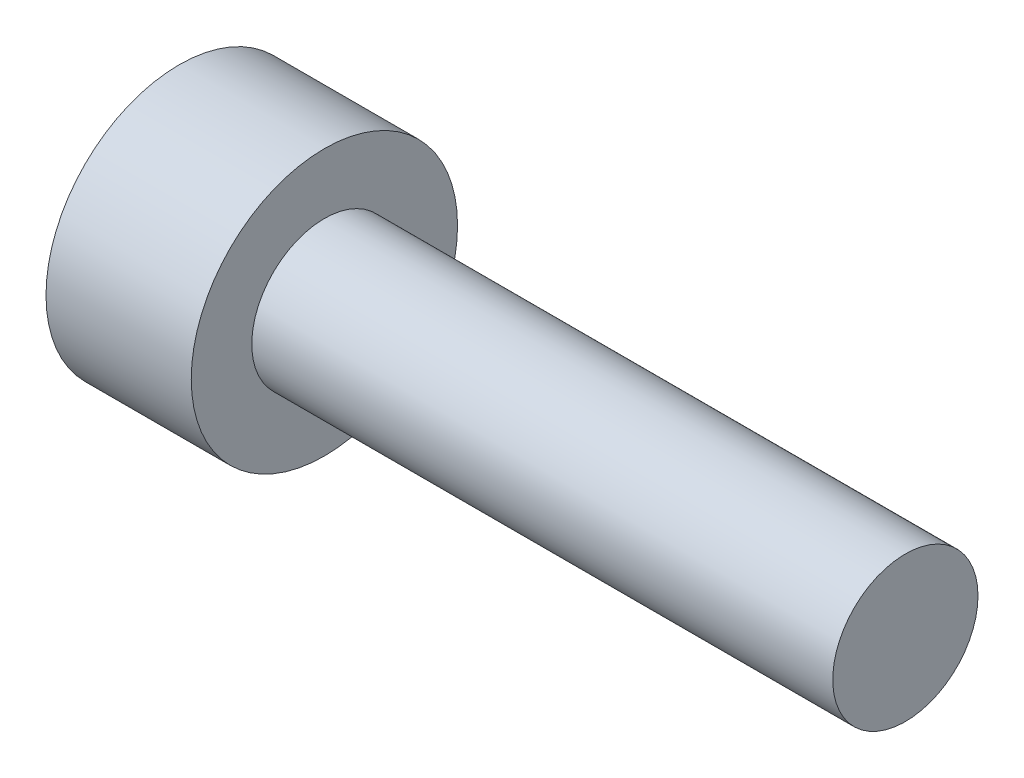
ISO-10303-21;
HEADER;
FILE_DESCRIPTION(('STEP AP214'),'2;1');
FILE_NAME('part.step','',(''),(''),'','','');
FILE_SCHEMA(('AUTOMOTIVE_DESIGN { 1 0 10303 214 1 1 1 1 }'));
ENDSEC;
DATA;
#1=APPLICATION_CONTEXT('core data for automotive mechanical design processes');
#2=APPLICATION_PROTOCOL_DEFINITION('international standard','automotive_design',2000,#1);
#3=PRODUCT_CONTEXT('',#1,'mechanical');
#4=PRODUCT('Part','Part','',(#3));
#5=PRODUCT_RELATED_PRODUCT_CATEGORY('part','',(#4));
#6=PRODUCT_DEFINITION_FORMATION('','',#4);
#7=PRODUCT_DEFINITION_CONTEXT('part definition',#1,'design');
#8=PRODUCT_DEFINITION('design','',#6,#7);
#9=PRODUCT_DEFINITION_SHAPE('','',#8);
#10=(LENGTH_UNIT() NAMED_UNIT(*) SI_UNIT(.MILLI.,.METRE.));
#11=(NAMED_UNIT(*) PLANE_ANGLE_UNIT() SI_UNIT($,.RADIAN.));
#12=(NAMED_UNIT(*) SI_UNIT($,.STERADIAN.) SOLID_ANGLE_UNIT());
#13=UNCERTAINTY_MEASURE_WITH_UNIT(LENGTH_MEASURE(1.E-05),#10,'distance_accuracy_value','');
#14=(GEOMETRIC_REPRESENTATION_CONTEXT(3) GLOBAL_UNCERTAINTY_ASSIGNED_CONTEXT((#13)) GLOBAL_UNIT_ASSIGNED_CONTEXT((#10,
#11,#12)) REPRESENTATION_CONTEXT('',''));
#15=CARTESIAN_POINT('',(0.,0.,0.));
#16=DIRECTION('',(0.,0.,1.));
#17=DIRECTION('',(1.,0.,0.));
#18=AXIS2_PLACEMENT_3D('',#15,#16,#17);
#19=CARTESIAN_POINT('',(25.,-38.,-11.5));
#20=DIRECTION('',(-1.,0.,0.));
#21=DIRECTION('',(0.,0.,1.));
#22=AXIS2_PLACEMENT_3D('',#19,#20,#21);
#23=CYLINDRICAL_SURFACE('',#22,1.5);
#24=CARTESIAN_POINT('',(25.,-38.,-11.5));
#25=DIRECTION('',(1.,0.,0.));
#26=DIRECTION('',(0.,0.,-1.));
#27=AXIS2_PLACEMENT_3D('',#24,#25,#26);
#28=CIRCLE('',#27,1.5);
#29=CARTESIAN_POINT('',(25.,-38.,-13.));
#30=VERTEX_POINT('',#29);
#31=EDGE_CURVE('E10',#30,#30,#28,.T.);
#32=ORIENTED_EDGE('',*,*,#31,.F.);
#33=EDGE_LOOP('',(#32));
#34=FACE_BOUND('',#33,.T.);
#35=CARTESIAN_POINT('',(13.,-38.,-11.5));
#36=DIRECTION('',(1.,0.,0.));
#37=DIRECTION('',(0.,0.,-1.));
#38=AXIS2_PLACEMENT_3D('',#35,#36,#37);
#39=CIRCLE('',#38,1.5);
#40=CARTESIAN_POINT('',(13.,-38.,-13.));
#41=VERTEX_POINT('',#40);
#42=EDGE_CURVE('E45',#41,#41,#39,.T.);
#43=ORIENTED_EDGE('',*,*,#42,.T.);
#44=EDGE_LOOP('',(#43));
#45=FACE_BOUND('',#44,.T.);
#46=ADVANCED_FACE('F39',(#34,#45),#23,.T.);
#47=CARTESIAN_POINT('',(25.,-38.,-11.5));
#48=DIRECTION('',(1.,0.,0.));
#49=DIRECTION('',(0.,0.,-1.));
#50=AXIS2_PLACEMENT_3D('',#47,#48,#49);
#51=PLANE('',#50);
#52=ORIENTED_EDGE('',*,*,#31,.T.);
#53=EDGE_LOOP('',(#52));
#54=FACE_BOUND('',#53,.T.);
#55=ADVANCED_FACE('F62',(#54),#51,.T.);
#56=CARTESIAN_POINT('',(13.,-38.,-11.5));
#57=DIRECTION('',(-1.,0.,0.));
#58=DIRECTION('',(0.,0.,1.));
#59=AXIS2_PLACEMENT_3D('',#56,#57,#58);
#60=CYLINDRICAL_SURFACE('',#59,2.75);
#61=CARTESIAN_POINT('',(13.,-38.,-11.5));
#62=DIRECTION('',(1.,0.,0.));
#63=DIRECTION('',(0.,0.,-1.));
#64=AXIS2_PLACEMENT_3D('',#61,#62,#63);
#65=CIRCLE('',#64,2.75);
#66=CARTESIAN_POINT('',(13.,-38.,-14.25));
#67=VERTEX_POINT('',#66);
#68=EDGE_CURVE('E47',#67,#67,#65,.T.);
#69=ORIENTED_EDGE('',*,*,#68,.F.);
#70=EDGE_LOOP('',(#69));
#71=FACE_BOUND('',#70,.T.);
#72=CARTESIAN_POINT('',(10.,-38.,-11.5));
#73=DIRECTION('',(1.,0.,0.));
#74=DIRECTION('',(0.,0.,-1.));
#75=AXIS2_PLACEMENT_3D('',#72,#73,#74);
#76=CIRCLE('',#75,2.75);
#77=CARTESIAN_POINT('',(10.,-38.,-14.25));
#78=VERTEX_POINT('',#77);
#79=EDGE_CURVE('E51',#78,#78,#76,.T.);
#80=ORIENTED_EDGE('',*,*,#79,.T.);
#81=EDGE_LOOP('',(#80));
#82=FACE_BOUND('',#81,.T.);
#83=ADVANCED_FACE('F56',(#71,#82),#60,.T.);
#84=CARTESIAN_POINT('',(13.,-38.,-11.5));
#85=DIRECTION('',(1.,0.,0.));
#86=DIRECTION('',(0.,0.,-1.));
#87=AXIS2_PLACEMENT_3D('',#84,#85,#86);
#88=PLANE('',#87);
#89=ORIENTED_EDGE('',*,*,#42,.F.);
#90=EDGE_LOOP('',(#89));
#91=FACE_BOUND('',#90,.T.);
#92=ORIENTED_EDGE('',*,*,#68,.T.);
#93=EDGE_LOOP('',(#92));
#94=FACE_BOUND('',#93,.T.);
#95=ADVANCED_FACE('F60',(#91,#94),#88,.T.);
#96=CARTESIAN_POINT('',(10.,-38.,-11.5));
#97=DIRECTION('',(1.,0.,0.));
#98=DIRECTION('',(0.,0.,-1.));
#99=AXIS2_PLACEMENT_3D('',#96,#97,#98);
#100=PLANE('',#99);
#101=ORIENTED_EDGE('',*,*,#79,.F.);
#102=EDGE_LOOP('',(#101));
#103=FACE_BOUND('',#102,.T.);
#104=ADVANCED_FACE('F66',(#103),#100,.F.);
#105=CLOSED_SHELL('',(#46,#55,#83,#95,#104));
#106=MANIFOLD_SOLID_BREP('B2',#105);
#107=ADVANCED_BREP_SHAPE_REPRESENTATION('',(#18,#106),#14);
#108=SHAPE_DEFINITION_REPRESENTATION(#9,#107);
ENDSEC;
END-ISO-10303-21;
